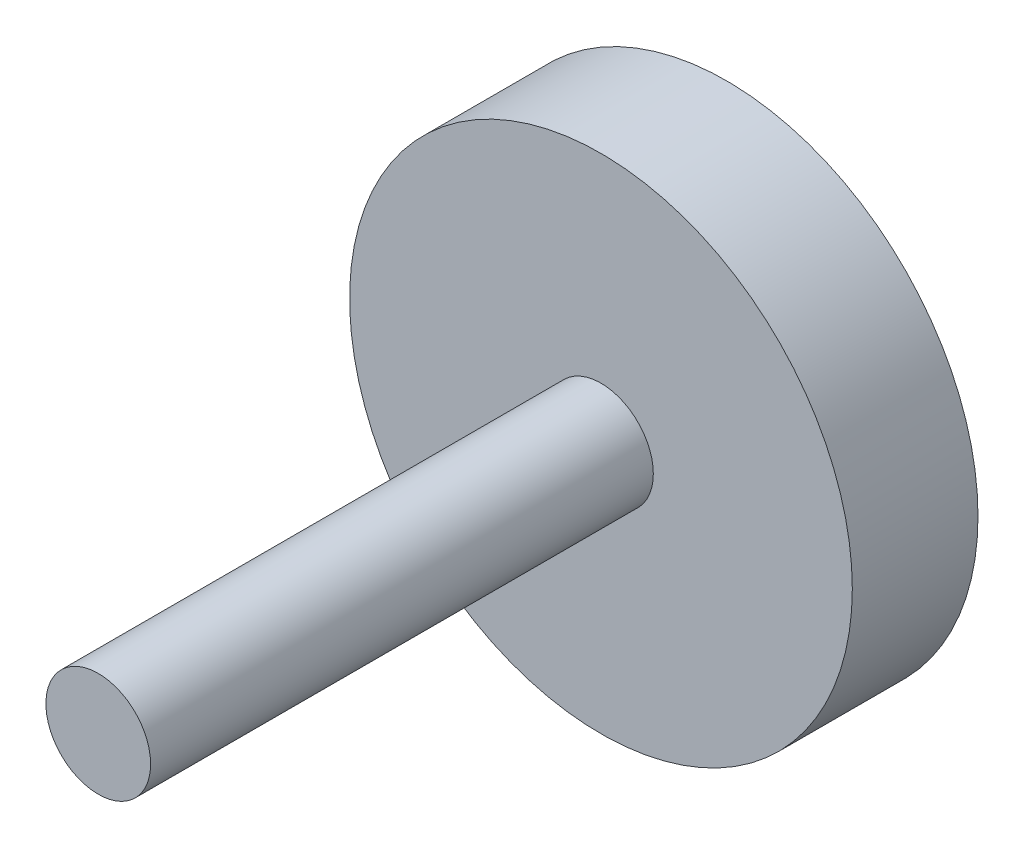
ISO-10303-21;
HEADER;
FILE_DESCRIPTION(('STEP AP214'),'2;1');
FILE_NAME('part.step','',(''),(''),'','','');
FILE_SCHEMA(('AUTOMOTIVE_DESIGN { 1 0 10303 214 1 1 1 1 }'));
ENDSEC;
DATA;
#1=APPLICATION_CONTEXT('core data for automotive mechanical design processes');
#2=APPLICATION_PROTOCOL_DEFINITION('international standard','automotive_design',2000,#1);
#3=PRODUCT_CONTEXT('',#1,'mechanical');
#4=PRODUCT('Part','Part','',(#3));
#5=PRODUCT_RELATED_PRODUCT_CATEGORY('part','',(#4));
#6=PRODUCT_DEFINITION_FORMATION('','',#4);
#7=PRODUCT_DEFINITION_CONTEXT('part definition',#1,'design');
#8=PRODUCT_DEFINITION('design','',#6,#7);
#9=PRODUCT_DEFINITION_SHAPE('','',#8);
#10=(LENGTH_UNIT() NAMED_UNIT(*) SI_UNIT(.MILLI.,.METRE.));
#11=(NAMED_UNIT(*) PLANE_ANGLE_UNIT() SI_UNIT($,.RADIAN.));
#12=(NAMED_UNIT(*) SI_UNIT($,.STERADIAN.) SOLID_ANGLE_UNIT());
#13=UNCERTAINTY_MEASURE_WITH_UNIT(LENGTH_MEASURE(1.E-05),#10,'distance_accuracy_value','');
#14=(GEOMETRIC_REPRESENTATION_CONTEXT(3) GLOBAL_UNCERTAINTY_ASSIGNED_CONTEXT((#13)) GLOBAL_UNIT_ASSIGNED_CONTEXT((#10,
#11,#12)) REPRESENTATION_CONTEXT('',''));
#15=CARTESIAN_POINT('',(0.,0.,0.));
#16=DIRECTION('',(0.,0.,1.));
#17=DIRECTION('',(1.,0.,0.));
#18=AXIS2_PLACEMENT_3D('',#15,#16,#17);
#19=CARTESIAN_POINT('',(0.,0.,10.));
#20=DIRECTION('',(0.,0.,-1.));
#21=DIRECTION('',(-1.,0.,0.));
#22=AXIS2_PLACEMENT_3D('',#19,#20,#21);
#23=CYLINDRICAL_SURFACE('',#22,20.);
#24=CARTESIAN_POINT('',(0.,0.,10.));
#25=DIRECTION('',(0.,0.,1.));
#26=DIRECTION('',(1.,0.,0.));
#27=AXIS2_PLACEMENT_3D('',#24,#25,#26);
#28=CIRCLE('',#27,20.);
#29=CARTESIAN_POINT('',(20.,0.,10.));
#30=VERTEX_POINT('',#29);
#31=EDGE_CURVE('E53',#30,#30,#28,.T.);
#32=ORIENTED_EDGE('',*,*,#31,.F.);
#33=EDGE_LOOP('',(#32));
#34=FACE_BOUND('',#33,.T.);
#35=CARTESIAN_POINT('',(0.,0.,0.));
#36=DIRECTION('',(0.,0.,1.));
#37=DIRECTION('',(1.,0.,0.));
#38=AXIS2_PLACEMENT_3D('',#35,#36,#37);
#39=CIRCLE('',#38,20.);
#40=CARTESIAN_POINT('',(20.,0.,0.));
#41=VERTEX_POINT('',#40);
#42=EDGE_CURVE('E48',#41,#41,#39,.T.);
#43=ORIENTED_EDGE('',*,*,#42,.T.);
#44=EDGE_LOOP('',(#43));
#45=FACE_BOUND('',#44,.T.);
#46=ADVANCED_FACE('F45',(#34,#45),#23,.T.);
#47=CARTESIAN_POINT('',(0.,0.,10.));
#48=DIRECTION('',(0.,0.,1.));
#49=DIRECTION('',(1.,0.,0.));
#50=AXIS2_PLACEMENT_3D('',#47,#48,#49);
#51=PLANE('',#50);
#52=CARTESIAN_POINT('',(0.,0.,10.));
#53=DIRECTION('',(0.,0.,1.));
#54=DIRECTION('',(1.,0.,0.));
#55=AXIS2_PLACEMENT_3D('',#52,#53,#54);
#56=CIRCLE('',#55,4.1656);
#57=CARTESIAN_POINT('',(4.1656,0.,10.));
#58=VERTEX_POINT('',#57);
#59=EDGE_CURVE('E10',#58,#58,#56,.T.);
#60=ORIENTED_EDGE('',*,*,#59,.F.);
#61=EDGE_LOOP('',(#60));
#62=FACE_BOUND('',#61,.T.);
#63=ORIENTED_EDGE('',*,*,#31,.T.);
#64=EDGE_LOOP('',(#63));
#65=FACE_BOUND('',#64,.T.);
#66=ADVANCED_FACE('F76',(#62,#65),#51,.T.);
#67=CARTESIAN_POINT('',(0.,0.,0.));
#68=DIRECTION('',(0.,0.,1.));
#69=DIRECTION('',(1.,0.,0.));
#70=AXIS2_PLACEMENT_3D('',#67,#68,#69);
#71=PLANE('',#70);
#72=ORIENTED_EDGE('',*,*,#42,.F.);
#73=EDGE_LOOP('',(#72));
#74=FACE_BOUND('',#73,.T.);
#75=ADVANCED_FACE('F73',(#74),#71,.F.);
#76=CARTESIAN_POINT('',(0.,0.,50.));
#77=DIRECTION('',(0.,0.,-1.));
#78=DIRECTION('',(-1.,0.,0.));
#79=AXIS2_PLACEMENT_3D('',#76,#77,#78);
#80=CYLINDRICAL_SURFACE('',#79,4.1656);
#81=CARTESIAN_POINT('',(0.,0.,50.));
#82=DIRECTION('',(0.,0.,1.));
#83=DIRECTION('',(1.,0.,0.));
#84=AXIS2_PLACEMENT_3D('',#81,#82,#83);
#85=CIRCLE('',#84,4.1656);
#86=CARTESIAN_POINT('',(4.1656,0.,50.));
#87=VERTEX_POINT('',#86);
#88=EDGE_CURVE('E61',#87,#87,#85,.T.);
#89=ORIENTED_EDGE('',*,*,#88,.F.);
#90=EDGE_LOOP('',(#89));
#91=FACE_BOUND('',#90,.T.);
#92=ORIENTED_EDGE('',*,*,#59,.T.);
#93=EDGE_LOOP('',(#92));
#94=FACE_BOUND('',#93,.T.);
#95=ADVANCED_FACE('F75',(#91,#94),#80,.T.);
#96=CARTESIAN_POINT('',(0.,0.,50.));
#97=DIRECTION('',(0.,0.,1.));
#98=DIRECTION('',(1.,0.,0.));
#99=AXIS2_PLACEMENT_3D('',#96,#97,#98);
#100=PLANE('',#99);
#101=ORIENTED_EDGE('',*,*,#88,.T.);
#102=EDGE_LOOP('',(#101));
#103=FACE_BOUND('',#102,.T.);
#104=ADVANCED_FACE('F82',(#103),#100,.T.);
#105=CLOSED_SHELL('',(#46,#66,#75,#95,#104));
#106=MANIFOLD_SOLID_BREP('B2',#105);
#107=ADVANCED_BREP_SHAPE_REPRESENTATION('',(#18,#106),#14);
#108=SHAPE_DEFINITION_REPRESENTATION(#9,#107);
ENDSEC;
END-ISO-10303-21;
